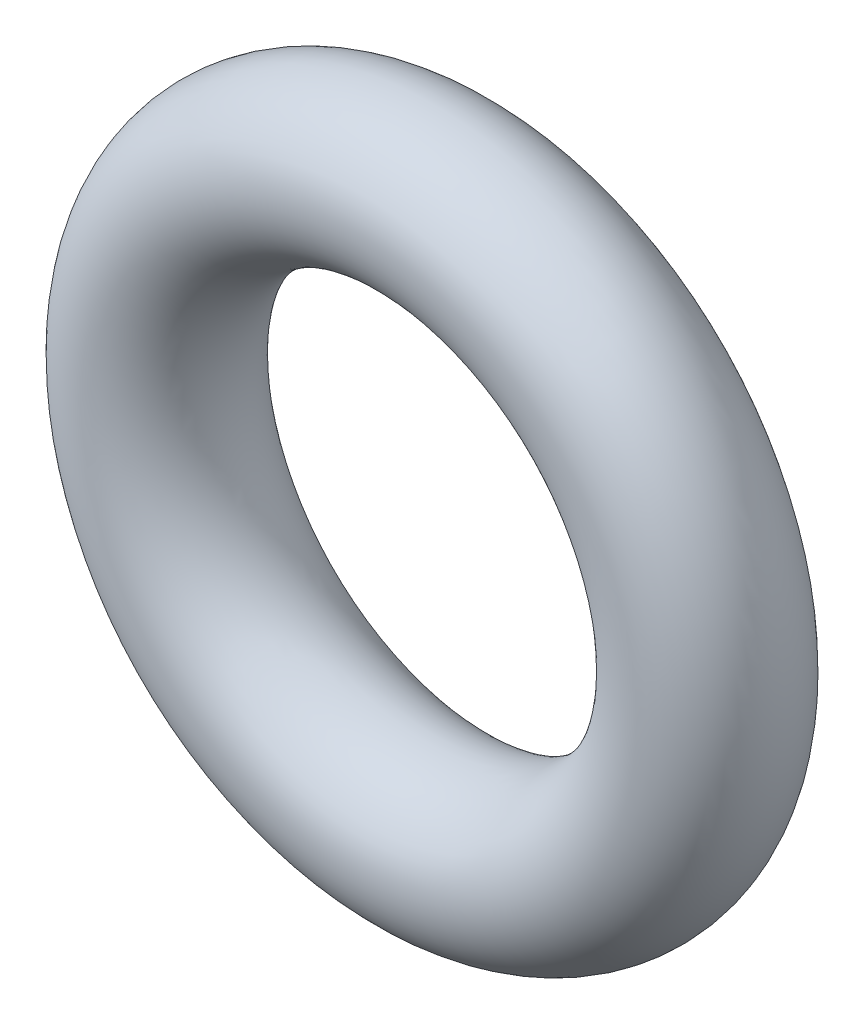
ISO-10303-21;
HEADER;
FILE_DESCRIPTION(('STEP AP214'),'2;1');
FILE_NAME('part.step','',(''),(''),'','','');
FILE_SCHEMA(('AUTOMOTIVE_DESIGN { 1 0 10303 214 1 1 1 1 }'));
ENDSEC;
DATA;
#1=APPLICATION_CONTEXT('core data for automotive mechanical design processes');
#2=APPLICATION_PROTOCOL_DEFINITION('international standard','automotive_design',2000,#1);
#3=PRODUCT_CONTEXT('',#1,'mechanical');
#4=PRODUCT('Part','Part','',(#3));
#5=PRODUCT_RELATED_PRODUCT_CATEGORY('part','',(#4));
#6=PRODUCT_DEFINITION_FORMATION('','',#4);
#7=PRODUCT_DEFINITION_CONTEXT('part definition',#1,'design');
#8=PRODUCT_DEFINITION('design','',#6,#7);
#9=PRODUCT_DEFINITION_SHAPE('','',#8);
#10=(LENGTH_UNIT() NAMED_UNIT(*) SI_UNIT(.MILLI.,.METRE.));
#11=(NAMED_UNIT(*) PLANE_ANGLE_UNIT() SI_UNIT($,.RADIAN.));
#12=(NAMED_UNIT(*) SI_UNIT($,.STERADIAN.) SOLID_ANGLE_UNIT());
#13=UNCERTAINTY_MEASURE_WITH_UNIT(LENGTH_MEASURE(1.E-05),#10,'distance_accuracy_value','');
#14=(GEOMETRIC_REPRESENTATION_CONTEXT(3) GLOBAL_UNCERTAINTY_ASSIGNED_CONTEXT((#13)) GLOBAL_UNIT_ASSIGNED_CONTEXT((#10,
#11,#12)) REPRESENTATION_CONTEXT('',''));
#15=CARTESIAN_POINT('',(0.,0.,0.));
#16=DIRECTION('',(0.,0.,1.));
#17=DIRECTION('',(1.,0.,0.));
#18=AXIS2_PLACEMENT_3D('',#15,#16,#17);
#19=CARTESIAN_POINT('',(0.,0.,0.));
#20=DIRECTION('',(0.,0.,1.));
#21=DIRECTION('',(1.,0.,0.));
#22=AXIS2_PLACEMENT_3D('',#19,#20,#21);
#23=TOROIDAL_SURFACE('',#22,3.1242,0.888999999999999);
#24=CARTESIAN_POINT('',(4.0132,0.,0.));
#25=VERTEX_POINT('',#24);
#26=VERTEX_LOOP('',#25);
#27=FACE_BOUND('',#26,.T.);
#28=ADVANCED_FACE('F28',(#27),#23,.T.);
#29=CLOSED_SHELL('',(#28));
#30=MANIFOLD_SOLID_BREP('B2',#29);
#31=ADVANCED_BREP_SHAPE_REPRESENTATION('',(#18,#30),#14);
#32=SHAPE_DEFINITION_REPRESENTATION(#9,#31);
ENDSEC;
END-ISO-10303-21;
